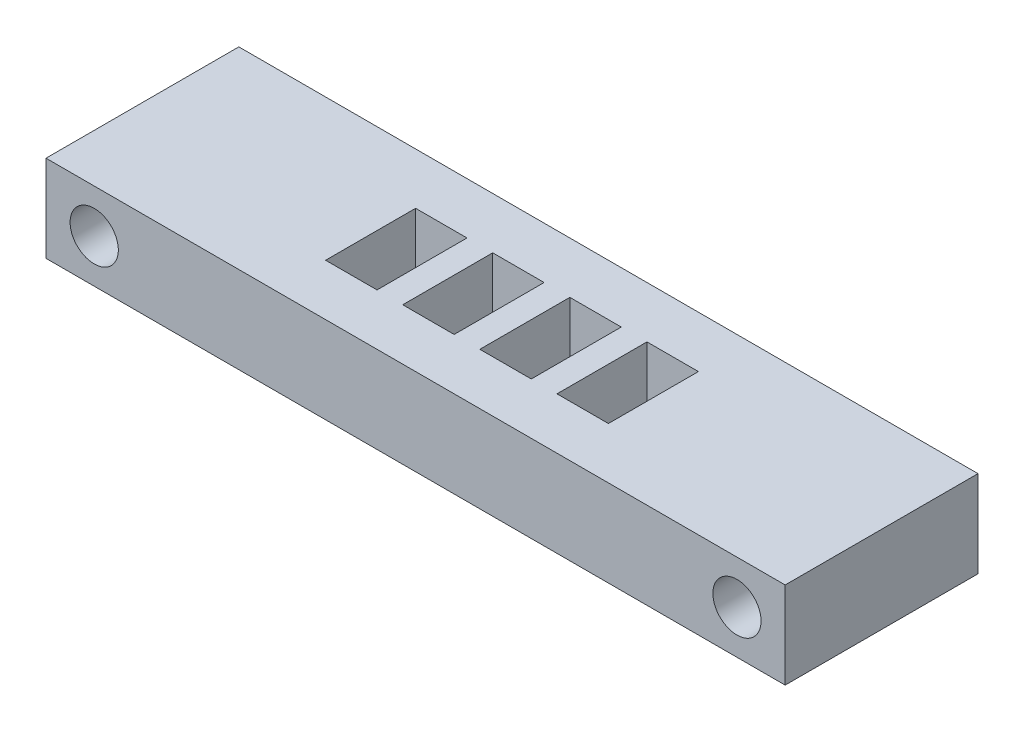
ISO-10303-21;
HEADER;
FILE_DESCRIPTION(('STEP AP214'),'2;1');
FILE_NAME('part.step','',(''),(''),'','','');
FILE_SCHEMA(('AUTOMOTIVE_DESIGN { 1 0 10303 214 1 1 1 1 }'));
ENDSEC;
DATA;
#1=APPLICATION_CONTEXT('core data for automotive mechanical design processes');
#2=APPLICATION_PROTOCOL_DEFINITION('international standard','automotive_design',2000,#1);
#3=PRODUCT_CONTEXT('',#1,'mechanical');
#4=PRODUCT('Part','Part','',(#3));
#5=PRODUCT_RELATED_PRODUCT_CATEGORY('part','',(#4));
#6=PRODUCT_DEFINITION_FORMATION('','',#4);
#7=PRODUCT_DEFINITION_CONTEXT('part definition',#1,'design');
#8=PRODUCT_DEFINITION('design','',#6,#7);
#9=PRODUCT_DEFINITION_SHAPE('','',#8);
#10=(LENGTH_UNIT() NAMED_UNIT(*) SI_UNIT(.MILLI.,.METRE.));
#11=(NAMED_UNIT(*) PLANE_ANGLE_UNIT() SI_UNIT($,.RADIAN.));
#12=(NAMED_UNIT(*) SI_UNIT($,.STERADIAN.) SOLID_ANGLE_UNIT());
#13=UNCERTAINTY_MEASURE_WITH_UNIT(LENGTH_MEASURE(1.E-05),#10,'distance_accuracy_value','');
#14=(GEOMETRIC_REPRESENTATION_CONTEXT(3) GLOBAL_UNCERTAINTY_ASSIGNED_CONTEXT((#13)) GLOBAL_UNIT_ASSIGNED_CONTEXT((#10,
#11,#12)) REPRESENTATION_CONTEXT('',''));
#15=CARTESIAN_POINT('',(0.,0.,0.));
#16=DIRECTION('',(0.,0.,1.));
#17=DIRECTION('',(1.,0.,0.));
#18=AXIS2_PLACEMENT_3D('',#15,#16,#17);
#19=CARTESIAN_POINT('',(0.,6.75,0.));
#20=DIRECTION('',(0.,-1.,0.));
#21=DIRECTION('',(0.,0.,-1.));
#22=AXIS2_PLACEMENT_3D('',#19,#20,#21);
#23=PLANE('',#22);
#24=DIRECTION('',(-1.,0.,0.));
#25=VECTOR('',#24,1.);
#26=CARTESIAN_POINT('',(17.75,6.75,-11.));
#27=LINE('',#26,#25);
#28=CARTESIAN_POINT('',(21.75,6.75,-11.));
#29=VERTEX_POINT('',#28);
#30=CARTESIAN_POINT('',(17.75,6.75,-11.));
#31=VERTEX_POINT('',#30);
#32=EDGE_CURVE('E219',#29,#31,#27,.T.);
#33=ORIENTED_EDGE('',*,*,#32,.F.);
#34=DIRECTION('',(0.,0.,-1.));
#35=VECTOR('',#34,1.);
#36=CARTESIAN_POINT('',(21.75,6.75,-11.));
#37=LINE('',#36,#35);
#38=CARTESIAN_POINT('',(21.75,6.75,-3.99999999999996));
#39=VERTEX_POINT('',#38);
#40=EDGE_CURVE('E227',#39,#29,#37,.T.);
#41=ORIENTED_EDGE('',*,*,#40,.F.);
#42=DIRECTION('',(1.,0.,0.));
#43=VECTOR('',#42,1.);
#44=CARTESIAN_POINT('',(17.75,6.75,-3.99999999999996));
#45=LINE('',#44,#43);
#46=CARTESIAN_POINT('',(17.75,6.75,-3.99999999999996));
#47=VERTEX_POINT('',#46);
#48=EDGE_CURVE('E224',#47,#39,#45,.T.);
#49=ORIENTED_EDGE('',*,*,#48,.F.);
#50=DIRECTION('',(0.,0.,1.));
#51=VECTOR('',#50,1.);
#52=CARTESIAN_POINT('',(17.75,6.75,-11.));
#53=LINE('',#52,#51);
#54=EDGE_CURVE('E221',#31,#47,#53,.T.);
#55=ORIENTED_EDGE('',*,*,#54,.F.);
#56=EDGE_LOOP('',(#33,#41,#49,#55));
#57=FACE_BOUND('',#56,.T.);
#58=DIRECTION('',(0.,0.,1.));
#59=VECTOR('',#58,1.);
#60=CARTESIAN_POINT('',(23.75,6.75,-11.));
#61=LINE('',#60,#59);
#62=CARTESIAN_POINT('',(23.75,6.75,-11.));
#63=VERTEX_POINT('',#62);
#64=CARTESIAN_POINT('',(23.75,6.75,-4.));
#65=VERTEX_POINT('',#64);
#66=EDGE_CURVE('E281',#63,#65,#61,.T.);
#67=ORIENTED_EDGE('',*,*,#66,.F.);
#68=DIRECTION('',(-1.,0.,0.));
#69=VECTOR('',#68,1.);
#70=CARTESIAN_POINT('',(23.75,6.75,-11.));
#71=LINE('',#70,#69);
#72=CARTESIAN_POINT('',(27.75,6.75,-11.));
#73=VERTEX_POINT('',#72);
#74=EDGE_CURVE('E289',#73,#63,#71,.T.);
#75=ORIENTED_EDGE('',*,*,#74,.F.);
#76=DIRECTION('',(0.,0.,-1.));
#77=VECTOR('',#76,1.);
#78=CARTESIAN_POINT('',(27.75,6.75,-11.));
#79=LINE('',#78,#77);
#80=CARTESIAN_POINT('',(27.75,6.75,-4.));
#81=VERTEX_POINT('',#80);
#82=EDGE_CURVE('E286',#81,#73,#79,.T.);
#83=ORIENTED_EDGE('',*,*,#82,.F.);
#84=DIRECTION('',(1.,0.,0.));
#85=VECTOR('',#84,1.);
#86=CARTESIAN_POINT('',(23.75,6.75,-4.));
#87=LINE('',#86,#85);
#88=EDGE_CURVE('E283',#65,#81,#87,.T.);
#89=ORIENTED_EDGE('',*,*,#88,.F.);
#90=EDGE_LOOP('',(#67,#75,#83,#89));
#91=FACE_BOUND('',#90,.T.);
#92=DIRECTION('',(0.,0.,1.));
#93=VECTOR('',#92,1.);
#94=CARTESIAN_POINT('',(0.,6.75,0.));
#95=LINE('',#94,#93);
#96=CARTESIAN_POINT('',(0.,6.75,-15.));
#97=VERTEX_POINT('',#96);
#98=CARTESIAN_POINT('',(0.,6.75,0.));
#99=VERTEX_POINT('',#98);
#100=EDGE_CURVE('E312',#97,#99,#95,.T.);
#101=ORIENTED_EDGE('',*,*,#100,.T.);
#102=DIRECTION('',(1.,0.,0.));
#103=VECTOR('',#102,1.);
#104=CARTESIAN_POINT('',(0.,6.75,0.));
#105=LINE('',#104,#103);
#106=CARTESIAN_POINT('',(57.5,6.75,0.));
#107=VERTEX_POINT('',#106);
#108=EDGE_CURVE('E315',#99,#107,#105,.T.);
#109=ORIENTED_EDGE('',*,*,#108,.T.);
#110=DIRECTION('',(0.,0.,-1.));
#111=VECTOR('',#110,1.);
#112=CARTESIAN_POINT('',(57.5,6.75,0.));
#113=LINE('',#112,#111);
#114=CARTESIAN_POINT('',(57.5,6.75,-15.));
#115=VERTEX_POINT('',#114);
#116=EDGE_CURVE('E318',#107,#115,#113,.T.);
#117=ORIENTED_EDGE('',*,*,#116,.T.);
#118=DIRECTION('',(-1.,0.,0.));
#119=VECTOR('',#118,1.);
#120=CARTESIAN_POINT('',(0.,6.75,-15.));
#121=LINE('',#120,#119);
#122=EDGE_CURVE('E320',#115,#97,#121,.T.);
#123=ORIENTED_EDGE('',*,*,#122,.T.);
#124=EDGE_LOOP('',(#101,#109,#117,#123));
#125=FACE_BOUND('',#124,.T.);
#126=DIRECTION('',(0.,0.,-1.));
#127=VECTOR('',#126,1.);
#128=CARTESIAN_POINT('',(33.75,6.75,-11.));
#129=LINE('',#128,#127);
#130=CARTESIAN_POINT('',(33.75,6.75,-4.));
#131=VERTEX_POINT('',#130);
#132=CARTESIAN_POINT('',(33.75,6.75,-11.));
#133=VERTEX_POINT('',#132);
#134=EDGE_CURVE('E250',#131,#133,#129,.T.);
#135=ORIENTED_EDGE('',*,*,#134,.F.);
#136=DIRECTION('',(1.,0.,0.));
#137=VECTOR('',#136,1.);
#138=CARTESIAN_POINT('',(33.75,6.75,-4.));
#139=LINE('',#138,#137);
#140=CARTESIAN_POINT('',(29.75,6.75,-4.));
#141=VERTEX_POINT('',#140);
#142=EDGE_CURVE('E258',#141,#131,#139,.T.);
#143=ORIENTED_EDGE('',*,*,#142,.F.);
#144=DIRECTION('',(0.,0.,1.));
#145=VECTOR('',#144,1.);
#146=CARTESIAN_POINT('',(29.75,6.75,-11.));
#147=LINE('',#146,#145);
#148=CARTESIAN_POINT('',(29.75,6.75,-11.));
#149=VERTEX_POINT('',#148);
#150=EDGE_CURVE('E255',#149,#141,#147,.T.);
#151=ORIENTED_EDGE('',*,*,#150,.F.);
#152=DIRECTION('',(-1.,0.,0.));
#153=VECTOR('',#152,1.);
#154=CARTESIAN_POINT('',(33.75,6.75,-11.));
#155=LINE('',#154,#153);
#156=EDGE_CURVE('E252',#133,#149,#155,.T.);
#157=ORIENTED_EDGE('',*,*,#156,.F.);
#158=EDGE_LOOP('',(#135,#143,#151,#157));
#159=FACE_BOUND('',#158,.T.);
#160=DIRECTION('',(0.,0.,-1.));
#161=VECTOR('',#160,1.);
#162=CARTESIAN_POINT('',(39.75,6.75,-11.));
#163=LINE('',#162,#161);
#164=CARTESIAN_POINT('',(39.75,6.75,-3.99999999999996));
#165=VERTEX_POINT('',#164);
#166=CARTESIAN_POINT('',(39.75,6.75,-11.));
#167=VERTEX_POINT('',#166);
#168=EDGE_CURVE('E181',#165,#167,#163,.T.);
#169=ORIENTED_EDGE('',*,*,#168,.F.);
#170=DIRECTION('',(1.,0.,0.));
#171=VECTOR('',#170,1.);
#172=CARTESIAN_POINT('',(39.75,6.75,-3.99999999999996));
#173=LINE('',#172,#171);
#174=CARTESIAN_POINT('',(35.75,6.75,-3.99999999999996));
#175=VERTEX_POINT('',#174);
#176=EDGE_CURVE('E203',#175,#165,#173,.T.);
#177=ORIENTED_EDGE('',*,*,#176,.F.);
#178=DIRECTION('',(0.,0.,1.));
#179=VECTOR('',#178,1.);
#180=CARTESIAN_POINT('',(35.75,6.75,-11.));
#181=LINE('',#180,#179);
#182=CARTESIAN_POINT('',(35.75,6.75,-11.));
#183=VERTEX_POINT('',#182);
#184=EDGE_CURVE('E201',#183,#175,#181,.T.);
#185=ORIENTED_EDGE('',*,*,#184,.F.);
#186=DIRECTION('',(-1.,0.,0.));
#187=VECTOR('',#186,1.);
#188=CARTESIAN_POINT('',(39.75,6.75,-11.));
#189=LINE('',#188,#187);
#190=EDGE_CURVE('E189',#167,#183,#189,.T.);
#191=ORIENTED_EDGE('',*,*,#190,.F.);
#192=EDGE_LOOP('',(#169,#177,#185,#191));
#193=FACE_BOUND('',#192,.T.);
#194=ADVANCED_FACE('F44',(#57,#91,#125,#159,#193),#23,.F.);
#195=CARTESIAN_POINT('',(0.,0.,0.));
#196=DIRECTION('',(0.,-1.,0.));
#197=DIRECTION('',(0.,0.,-1.));
#198=AXIS2_PLACEMENT_3D('',#195,#196,#197);
#199=PLANE('',#198);
#200=DIRECTION('',(0.,0.,1.));
#201=VECTOR('',#200,1.);
#202=CARTESIAN_POINT('',(0.,0.,0.));
#203=LINE('',#202,#201);
#204=CARTESIAN_POINT('',(0.,0.,-15.));
#205=VERTEX_POINT('',#204);
#206=CARTESIAN_POINT('',(0.,0.,0.));
#207=VERTEX_POINT('',#206);
#208=EDGE_CURVE('E311',#205,#207,#203,.T.);
#209=ORIENTED_EDGE('',*,*,#208,.F.);
#210=DIRECTION('',(-1.,0.,0.));
#211=VECTOR('',#210,1.);
#212=CARTESIAN_POINT('',(0.,0.,-15.));
#213=LINE('',#212,#211);
#214=CARTESIAN_POINT('',(57.5,0.,-15.));
#215=VERTEX_POINT('',#214);
#216=EDGE_CURVE('E316',#215,#205,#213,.T.);
#217=ORIENTED_EDGE('',*,*,#216,.F.);
#218=DIRECTION('',(0.,0.,-1.));
#219=VECTOR('',#218,1.);
#220=CARTESIAN_POINT('',(57.5,0.,0.));
#221=LINE('',#220,#219);
#222=CARTESIAN_POINT('',(57.5,0.,0.));
#223=VERTEX_POINT('',#222);
#224=EDGE_CURVE('E327',#223,#215,#221,.T.);
#225=ORIENTED_EDGE('',*,*,#224,.F.);
#226=DIRECTION('',(1.,0.,0.));
#227=VECTOR('',#226,1.);
#228=CARTESIAN_POINT('',(0.,0.,0.));
#229=LINE('',#228,#227);
#230=EDGE_CURVE('E325',#207,#223,#229,.T.);
#231=ORIENTED_EDGE('',*,*,#230,.F.);
#232=EDGE_LOOP('',(#209,#217,#225,#231));
#233=FACE_BOUND('',#232,.T.);
#234=DIRECTION('',(-1.,0.,0.));
#235=VECTOR('',#234,1.);
#236=CARTESIAN_POINT('',(23.75,0.,-11.));
#237=LINE('',#236,#235);
#238=CARTESIAN_POINT('',(27.75,0.,-11.));
#239=VERTEX_POINT('',#238);
#240=CARTESIAN_POINT('',(23.75,0.,-11.));
#241=VERTEX_POINT('',#240);
#242=EDGE_CURVE('E284',#239,#241,#237,.T.);
#243=ORIENTED_EDGE('',*,*,#242,.T.);
#244=DIRECTION('',(0.,0.,1.));
#245=VECTOR('',#244,1.);
#246=CARTESIAN_POINT('',(23.75,0.,-11.));
#247=LINE('',#246,#245);
#248=CARTESIAN_POINT('',(23.75,0.,-4.));
#249=VERTEX_POINT('',#248);
#250=EDGE_CURVE('E280',#241,#249,#247,.T.);
#251=ORIENTED_EDGE('',*,*,#250,.T.);
#252=DIRECTION('',(1.,0.,0.));
#253=VECTOR('',#252,1.);
#254=CARTESIAN_POINT('',(23.75,0.,-4.));
#255=LINE('',#254,#253);
#256=CARTESIAN_POINT('',(27.75,0.,-4.));
#257=VERTEX_POINT('',#256);
#258=EDGE_CURVE('E294',#249,#257,#255,.T.);
#259=ORIENTED_EDGE('',*,*,#258,.T.);
#260=DIRECTION('',(0.,0.,-1.));
#261=VECTOR('',#260,1.);
#262=CARTESIAN_POINT('',(27.75,0.,-11.));
#263=LINE('',#262,#261);
#264=EDGE_CURVE('E297',#257,#239,#263,.T.);
#265=ORIENTED_EDGE('',*,*,#264,.T.);
#266=EDGE_LOOP('',(#243,#251,#259,#265));
#267=FACE_BOUND('',#266,.T.);
#268=DIRECTION('',(1.,0.,0.));
#269=VECTOR('',#268,1.);
#270=CARTESIAN_POINT('',(33.75,0.,-4.));
#271=LINE('',#270,#269);
#272=CARTESIAN_POINT('',(29.75,0.,-4.));
#273=VERTEX_POINT('',#272);
#274=CARTESIAN_POINT('',(33.75,0.,-4.));
#275=VERTEX_POINT('',#274);
#276=EDGE_CURVE('E253',#273,#275,#271,.T.);
#277=ORIENTED_EDGE('',*,*,#276,.T.);
#278=DIRECTION('',(0.,0.,-1.));
#279=VECTOR('',#278,1.);
#280=CARTESIAN_POINT('',(33.75,0.,-11.));
#281=LINE('',#280,#279);
#282=CARTESIAN_POINT('',(33.75,0.,-11.));
#283=VERTEX_POINT('',#282);
#284=EDGE_CURVE('E249',#275,#283,#281,.T.);
#285=ORIENTED_EDGE('',*,*,#284,.T.);
#286=DIRECTION('',(-1.,0.,0.));
#287=VECTOR('',#286,1.);
#288=CARTESIAN_POINT('',(33.75,0.,-11.));
#289=LINE('',#288,#287);
#290=CARTESIAN_POINT('',(29.75,0.,-11.));
#291=VERTEX_POINT('',#290);
#292=EDGE_CURVE('E263',#283,#291,#289,.T.);
#293=ORIENTED_EDGE('',*,*,#292,.T.);
#294=DIRECTION('',(0.,0.,1.));
#295=VECTOR('',#294,1.);
#296=CARTESIAN_POINT('',(29.75,0.,-11.));
#297=LINE('',#296,#295);
#298=EDGE_CURVE('E266',#291,#273,#297,.T.);
#299=ORIENTED_EDGE('',*,*,#298,.T.);
#300=EDGE_LOOP('',(#277,#285,#293,#299));
#301=FACE_BOUND('',#300,.T.);
#302=DIRECTION('',(0.,0.,-1.));
#303=VECTOR('',#302,1.);
#304=CARTESIAN_POINT('',(21.75,0.,-11.));
#305=LINE('',#304,#303);
#306=CARTESIAN_POINT('',(21.75,0.,-3.99999999999996));
#307=VERTEX_POINT('',#306);
#308=CARTESIAN_POINT('',(21.75,0.,-11.));
#309=VERTEX_POINT('',#308);
#310=EDGE_CURVE('E222',#307,#309,#305,.T.);
#311=ORIENTED_EDGE('',*,*,#310,.T.);
#312=DIRECTION('',(-1.,0.,0.));
#313=VECTOR('',#312,1.);
#314=CARTESIAN_POINT('',(17.75,0.,-11.));
#315=LINE('',#314,#313);
#316=CARTESIAN_POINT('',(17.75,0.,-11.));
#317=VERTEX_POINT('',#316);
#318=EDGE_CURVE('E197',#309,#317,#315,.T.);
#319=ORIENTED_EDGE('',*,*,#318,.T.);
#320=DIRECTION('',(0.,0.,1.));
#321=VECTOR('',#320,1.);
#322=CARTESIAN_POINT('',(17.75,0.,-11.));
#323=LINE('',#322,#321);
#324=CARTESIAN_POINT('',(17.75,0.,-3.99999999999996));
#325=VERTEX_POINT('',#324);
#326=EDGE_CURVE('E232',#317,#325,#323,.T.);
#327=ORIENTED_EDGE('',*,*,#326,.T.);
#328=DIRECTION('',(1.,0.,0.));
#329=VECTOR('',#328,1.);
#330=CARTESIAN_POINT('',(17.75,0.,-3.99999999999996));
#331=LINE('',#330,#329);
#332=EDGE_CURVE('E235',#325,#307,#331,.T.);
#333=ORIENTED_EDGE('',*,*,#332,.T.);
#334=EDGE_LOOP('',(#311,#319,#327,#333));
#335=FACE_BOUND('',#334,.T.);
#336=DIRECTION('',(1.,0.,0.));
#337=VECTOR('',#336,1.);
#338=CARTESIAN_POINT('',(39.75,0.,-3.99999999999996));
#339=LINE('',#338,#337);
#340=CARTESIAN_POINT('',(35.75,0.,-3.99999999999996));
#341=VERTEX_POINT('',#340);
#342=CARTESIAN_POINT('',(39.75,0.,-3.99999999999996));
#343=VERTEX_POINT('',#342);
#344=EDGE_CURVE('E190',#341,#343,#339,.T.);
#345=ORIENTED_EDGE('',*,*,#344,.T.);
#346=DIRECTION('',(0.,0.,-1.));
#347=VECTOR('',#346,1.);
#348=CARTESIAN_POINT('',(39.75,0.,-11.));
#349=LINE('',#348,#347);
#350=CARTESIAN_POINT('',(39.75,0.,-11.));
#351=VERTEX_POINT('',#350);
#352=EDGE_CURVE('E67',#343,#351,#349,.T.);
#353=ORIENTED_EDGE('',*,*,#352,.T.);
#354=DIRECTION('',(-1.,0.,0.));
#355=VECTOR('',#354,1.);
#356=CARTESIAN_POINT('',(39.75,0.,-11.));
#357=LINE('',#356,#355);
#358=CARTESIAN_POINT('',(35.75,0.,-11.));
#359=VERTEX_POINT('',#358);
#360=EDGE_CURVE('E196',#351,#359,#357,.T.);
#361=ORIENTED_EDGE('',*,*,#360,.T.);
#362=DIRECTION('',(0.,0.,1.));
#363=VECTOR('',#362,1.);
#364=CARTESIAN_POINT('',(35.75,0.,-11.));
#365=LINE('',#364,#363);
#366=EDGE_CURVE('E211',#359,#341,#365,.T.);
#367=ORIENTED_EDGE('',*,*,#366,.T.);
#368=EDGE_LOOP('',(#345,#353,#361,#367));
#369=FACE_BOUND('',#368,.T.);
#370=ADVANCED_FACE('F345',(#233,#267,#301,#335,#369),#199,.T.);
#371=CARTESIAN_POINT('',(0.,6.75,0.));
#372=DIRECTION('',(1.,0.,0.));
#373=DIRECTION('',(0.,0.,-1.));
#374=AXIS2_PLACEMENT_3D('',#371,#372,#373);
#375=PLANE('',#374);
#376=ORIENTED_EDGE('',*,*,#208,.T.);
#377=DIRECTION('',(0.,-1.,0.));
#378=VECTOR('',#377,1.);
#379=CARTESIAN_POINT('',(0.,6.75,0.));
#380=LINE('',#379,#378);
#381=EDGE_CURVE('E13',#99,#207,#380,.T.);
#382=ORIENTED_EDGE('',*,*,#381,.F.);
#383=ORIENTED_EDGE('',*,*,#100,.F.);
#384=DIRECTION('',(0.,-1.,0.));
#385=VECTOR('',#384,1.);
#386=CARTESIAN_POINT('',(0.,6.75,-15.));
#387=LINE('',#386,#385);
#388=EDGE_CURVE('E322',#97,#205,#387,.T.);
#389=ORIENTED_EDGE('',*,*,#388,.T.);
#390=EDGE_LOOP('',(#376,#382,#383,#389));
#391=FACE_BOUND('',#390,.T.);
#392=ADVANCED_FACE('F46',(#391),#375,.F.);
#393=CARTESIAN_POINT('',(0.,6.75,0.));
#394=DIRECTION('',(0.,0.,-1.));
#395=DIRECTION('',(-1.,0.,0.));
#396=AXIS2_PLACEMENT_3D('',#393,#394,#395);
#397=PLANE('',#396);
#398=CARTESIAN_POINT('',(53.75,3.375,0.));
#399=DIRECTION('',(0.,0.,-1.));
#400=DIRECTION('',(-1.,0.,0.));
#401=AXIS2_PLACEMENT_3D('',#398,#399,#400);
#402=CIRCLE('',#401,1.875);
#403=CARTESIAN_POINT('',(51.875,3.375,0.));
#404=VERTEX_POINT('',#403);
#405=EDGE_CURVE('E209',#404,#404,#402,.T.);
#406=ORIENTED_EDGE('',*,*,#405,.T.);
#407=EDGE_LOOP('',(#406));
#408=FACE_BOUND('',#407,.T.);
#409=CARTESIAN_POINT('',(3.75,3.375,0.));
#410=DIRECTION('',(0.,0.,-1.));
#411=DIRECTION('',(-1.,0.,0.));
#412=AXIS2_PLACEMENT_3D('',#409,#410,#411);
#413=CIRCLE('',#412,1.875);
#414=CARTESIAN_POINT('',(1.875,3.375,0.));
#415=VERTEX_POINT('',#414);
#416=EDGE_CURVE('E394',#415,#415,#413,.T.);
#417=ORIENTED_EDGE('',*,*,#416,.T.);
#418=EDGE_LOOP('',(#417));
#419=FACE_BOUND('',#418,.T.);
#420=ORIENTED_EDGE('',*,*,#230,.T.);
#421=DIRECTION('',(0.,-1.,0.));
#422=VECTOR('',#421,1.);
#423=CARTESIAN_POINT('',(57.5,6.75,0.));
#424=LINE('',#423,#422);
#425=EDGE_CURVE('E52',#107,#223,#424,.T.);
#426=ORIENTED_EDGE('',*,*,#425,.F.);
#427=ORIENTED_EDGE('',*,*,#108,.F.);
#428=ORIENTED_EDGE('',*,*,#381,.T.);
#429=EDGE_LOOP('',(#420,#426,#427,#428));
#430=FACE_BOUND('',#429,.T.);
#431=ADVANCED_FACE('F356',(#408,#419,#430),#397,.F.);
#432=CARTESIAN_POINT('',(57.5,6.75,0.));
#433=DIRECTION('',(-1.,0.,0.));
#434=DIRECTION('',(0.,0.,1.));
#435=AXIS2_PLACEMENT_3D('',#432,#433,#434);
#436=PLANE('',#435);
#437=ORIENTED_EDGE('',*,*,#224,.T.);
#438=DIRECTION('',(0.,-1.,0.));
#439=VECTOR('',#438,1.);
#440=CARTESIAN_POINT('',(57.5,6.75,-15.));
#441=LINE('',#440,#439);
#442=EDGE_CURVE('E332',#115,#215,#441,.T.);
#443=ORIENTED_EDGE('',*,*,#442,.F.);
#444=ORIENTED_EDGE('',*,*,#116,.F.);
#445=ORIENTED_EDGE('',*,*,#425,.T.);
#446=EDGE_LOOP('',(#437,#443,#444,#445));
#447=FACE_BOUND('',#446,.T.);
#448=ADVANCED_FACE('F339',(#447),#436,.F.);
#449=CARTESIAN_POINT('',(0.,6.75,-15.));
#450=DIRECTION('',(0.,0.,1.));
#451=DIRECTION('',(1.,0.,0.));
#452=AXIS2_PLACEMENT_3D('',#449,#450,#451);
#453=PLANE('',#452);
#454=CARTESIAN_POINT('',(53.75,3.375,-15.));
#455=DIRECTION('',(0.,0.,-1.));
#456=DIRECTION('',(-1.,0.,0.));
#457=AXIS2_PLACEMENT_3D('',#454,#455,#456);
#458=CIRCLE('',#457,1.875);
#459=CARTESIAN_POINT('',(51.875,3.375,-15.));
#460=VERTEX_POINT('',#459);
#461=EDGE_CURVE('E389',#460,#460,#458,.T.);
#462=ORIENTED_EDGE('',*,*,#461,.F.);
#463=EDGE_LOOP('',(#462));
#464=FACE_BOUND('',#463,.T.);
#465=CARTESIAN_POINT('',(3.75,3.375,-15.));
#466=DIRECTION('',(0.,0.,-1.));
#467=DIRECTION('',(-1.,0.,0.));
#468=AXIS2_PLACEMENT_3D('',#465,#466,#467);
#469=CIRCLE('',#468,1.875);
#470=CARTESIAN_POINT('',(1.875,3.375,-15.));
#471=VERTEX_POINT('',#470);
#472=EDGE_CURVE('E392',#471,#471,#469,.T.);
#473=ORIENTED_EDGE('',*,*,#472,.F.);
#474=EDGE_LOOP('',(#473));
#475=FACE_BOUND('',#474,.T.);
#476=ORIENTED_EDGE('',*,*,#216,.T.);
#477=ORIENTED_EDGE('',*,*,#388,.F.);
#478=ORIENTED_EDGE('',*,*,#122,.F.);
#479=ORIENTED_EDGE('',*,*,#442,.T.);
#480=EDGE_LOOP('',(#476,#477,#478,#479));
#481=FACE_BOUND('',#480,.T.);
#482=ADVANCED_FACE('F349',(#464,#475,#481),#453,.F.);
#483=CARTESIAN_POINT('',(23.75,6.75,-11.));
#484=DIRECTION('',(1.,0.,0.));
#485=DIRECTION('',(0.,0.,-1.));
#486=AXIS2_PLACEMENT_3D('',#483,#484,#485);
#487=PLANE('',#486);
#488=ORIENTED_EDGE('',*,*,#250,.F.);
#489=DIRECTION('',(0.,-1.,0.));
#490=VECTOR('',#489,1.);
#491=CARTESIAN_POINT('',(23.75,6.75,-11.));
#492=LINE('',#491,#490);
#493=EDGE_CURVE('E291',#63,#241,#492,.T.);
#494=ORIENTED_EDGE('',*,*,#493,.F.);
#495=ORIENTED_EDGE('',*,*,#66,.T.);
#496=DIRECTION('',(0.,-1.,0.));
#497=VECTOR('',#496,1.);
#498=CARTESIAN_POINT('',(23.75,6.75,-4.));
#499=LINE('',#498,#497);
#500=EDGE_CURVE('E308',#65,#249,#499,.T.);
#501=ORIENTED_EDGE('',*,*,#500,.T.);
#502=EDGE_LOOP('',(#488,#494,#495,#501));
#503=FACE_BOUND('',#502,.T.);
#504=ADVANCED_FACE('F376',(#503),#487,.T.);
#505=CARTESIAN_POINT('',(23.75,6.75,-4.));
#506=DIRECTION('',(0.,0.,-1.));
#507=DIRECTION('',(-1.,0.,0.));
#508=AXIS2_PLACEMENT_3D('',#505,#506,#507);
#509=PLANE('',#508);
#510=ORIENTED_EDGE('',*,*,#258,.F.);
#511=ORIENTED_EDGE('',*,*,#500,.F.);
#512=ORIENTED_EDGE('',*,*,#88,.T.);
#513=DIRECTION('',(0.,-1.,0.));
#514=VECTOR('',#513,1.);
#515=CARTESIAN_POINT('',(27.75,6.75,-4.));
#516=LINE('',#515,#514);
#517=EDGE_CURVE('E306',#81,#257,#516,.T.);
#518=ORIENTED_EDGE('',*,*,#517,.T.);
#519=EDGE_LOOP('',(#510,#511,#512,#518));
#520=FACE_BOUND('',#519,.T.);
#521=ADVANCED_FACE('F384',(#520),#509,.T.);
#522=CARTESIAN_POINT('',(27.75,6.75,-11.));
#523=DIRECTION('',(-1.,0.,0.));
#524=DIRECTION('',(0.,0.,1.));
#525=AXIS2_PLACEMENT_3D('',#522,#523,#524);
#526=PLANE('',#525);
#527=ORIENTED_EDGE('',*,*,#264,.F.);
#528=ORIENTED_EDGE('',*,*,#517,.F.);
#529=ORIENTED_EDGE('',*,*,#82,.T.);
#530=DIRECTION('',(0.,-1.,0.));
#531=VECTOR('',#530,1.);
#532=CARTESIAN_POINT('',(27.75,6.75,-11.));
#533=LINE('',#532,#531);
#534=EDGE_CURVE('E304',#73,#239,#533,.T.);
#535=ORIENTED_EDGE('',*,*,#534,.T.);
#536=EDGE_LOOP('',(#527,#528,#529,#535));
#537=FACE_BOUND('',#536,.T.);
#538=ADVANCED_FACE('F458',(#537),#526,.T.);
#539=CARTESIAN_POINT('',(23.75,6.75,-11.));
#540=DIRECTION('',(0.,0.,1.));
#541=DIRECTION('',(1.,0.,0.));
#542=AXIS2_PLACEMENT_3D('',#539,#540,#541);
#543=PLANE('',#542);
#544=ORIENTED_EDGE('',*,*,#242,.F.);
#545=ORIENTED_EDGE('',*,*,#534,.F.);
#546=ORIENTED_EDGE('',*,*,#74,.T.);
#547=ORIENTED_EDGE('',*,*,#493,.T.);
#548=EDGE_LOOP('',(#544,#545,#546,#547));
#549=FACE_BOUND('',#548,.T.);
#550=ADVANCED_FACE('F454',(#549),#543,.T.);
#551=CARTESIAN_POINT('',(33.75,6.75,-11.));
#552=DIRECTION('',(-1.,0.,0.));
#553=DIRECTION('',(0.,0.,1.));
#554=AXIS2_PLACEMENT_3D('',#551,#552,#553);
#555=PLANE('',#554);
#556=ORIENTED_EDGE('',*,*,#284,.F.);
#557=DIRECTION('',(0.,-1.,0.));
#558=VECTOR('',#557,1.);
#559=CARTESIAN_POINT('',(33.75,6.75,-4.));
#560=LINE('',#559,#558);
#561=EDGE_CURVE('E260',#131,#275,#560,.T.);
#562=ORIENTED_EDGE('',*,*,#561,.F.);
#563=ORIENTED_EDGE('',*,*,#134,.T.);
#564=DIRECTION('',(0.,-1.,0.));
#565=VECTOR('',#564,1.);
#566=CARTESIAN_POINT('',(33.75,6.75,-11.));
#567=LINE('',#566,#565);
#568=EDGE_CURVE('E277',#133,#283,#567,.T.);
#569=ORIENTED_EDGE('',*,*,#568,.T.);
#570=EDGE_LOOP('',(#556,#562,#563,#569));
#571=FACE_BOUND('',#570,.T.);
#572=ADVANCED_FACE('F450',(#571),#555,.T.);
#573=CARTESIAN_POINT('',(33.75,6.75,-11.));
#574=DIRECTION('',(0.,0.,1.));
#575=DIRECTION('',(1.,0.,0.));
#576=AXIS2_PLACEMENT_3D('',#573,#574,#575);
#577=PLANE('',#576);
#578=ORIENTED_EDGE('',*,*,#292,.F.);
#579=ORIENTED_EDGE('',*,*,#568,.F.);
#580=ORIENTED_EDGE('',*,*,#156,.T.);
#581=DIRECTION('',(0.,-1.,0.));
#582=VECTOR('',#581,1.);
#583=CARTESIAN_POINT('',(29.75,6.75,-11.));
#584=LINE('',#583,#582);
#585=EDGE_CURVE('E275',#149,#291,#584,.T.);
#586=ORIENTED_EDGE('',*,*,#585,.T.);
#587=EDGE_LOOP('',(#578,#579,#580,#586));
#588=FACE_BOUND('',#587,.T.);
#589=ADVANCED_FACE('F446',(#588),#577,.T.);
#590=CARTESIAN_POINT('',(29.75,6.75,-11.));
#591=DIRECTION('',(1.,0.,0.));
#592=DIRECTION('',(0.,0.,-1.));
#593=AXIS2_PLACEMENT_3D('',#590,#591,#592);
#594=PLANE('',#593);
#595=ORIENTED_EDGE('',*,*,#298,.F.);
#596=ORIENTED_EDGE('',*,*,#585,.F.);
#597=ORIENTED_EDGE('',*,*,#150,.T.);
#598=DIRECTION('',(0.,-1.,0.));
#599=VECTOR('',#598,1.);
#600=CARTESIAN_POINT('',(29.75,6.75,-4.));
#601=LINE('',#600,#599);
#602=EDGE_CURVE('E273',#141,#273,#601,.T.);
#603=ORIENTED_EDGE('',*,*,#602,.T.);
#604=EDGE_LOOP('',(#595,#596,#597,#603));
#605=FACE_BOUND('',#604,.T.);
#606=ADVANCED_FACE('F442',(#605),#594,.T.);
#607=CARTESIAN_POINT('',(33.75,6.75,-4.));
#608=DIRECTION('',(0.,0.,-1.));
#609=DIRECTION('',(-1.,0.,0.));
#610=AXIS2_PLACEMENT_3D('',#607,#608,#609);
#611=PLANE('',#610);
#612=ORIENTED_EDGE('',*,*,#276,.F.);
#613=ORIENTED_EDGE('',*,*,#602,.F.);
#614=ORIENTED_EDGE('',*,*,#142,.T.);
#615=ORIENTED_EDGE('',*,*,#561,.T.);
#616=EDGE_LOOP('',(#612,#613,#614,#615));
#617=FACE_BOUND('',#616,.T.);
#618=ADVANCED_FACE('F438',(#617),#611,.T.);
#619=CARTESIAN_POINT('',(17.75,6.75,-11.));
#620=DIRECTION('',(0.,0.,1.));
#621=DIRECTION('',(1.,0.,0.));
#622=AXIS2_PLACEMENT_3D('',#619,#620,#621);
#623=PLANE('',#622);
#624=ORIENTED_EDGE('',*,*,#318,.F.);
#625=DIRECTION('',(0.,-1.,0.));
#626=VECTOR('',#625,1.);
#627=CARTESIAN_POINT('',(21.75,6.75,-11.));
#628=LINE('',#627,#626);
#629=EDGE_CURVE('E229',#29,#309,#628,.T.);
#630=ORIENTED_EDGE('',*,*,#629,.F.);
#631=ORIENTED_EDGE('',*,*,#32,.T.);
#632=DIRECTION('',(0.,-1.,0.));
#633=VECTOR('',#632,1.);
#634=CARTESIAN_POINT('',(17.75,6.75,-11.));
#635=LINE('',#634,#633);
#636=EDGE_CURVE('E246',#31,#317,#635,.T.);
#637=ORIENTED_EDGE('',*,*,#636,.T.);
#638=EDGE_LOOP('',(#624,#630,#631,#637));
#639=FACE_BOUND('',#638,.T.);
#640=ADVANCED_FACE('F434',(#639),#623,.T.);
#641=CARTESIAN_POINT('',(17.75,6.75,-11.));
#642=DIRECTION('',(1.,0.,0.));
#643=DIRECTION('',(0.,0.,-1.));
#644=AXIS2_PLACEMENT_3D('',#641,#642,#643);
#645=PLANE('',#644);
#646=ORIENTED_EDGE('',*,*,#326,.F.);
#647=ORIENTED_EDGE('',*,*,#636,.F.);
#648=ORIENTED_EDGE('',*,*,#54,.T.);
#649=DIRECTION('',(0.,-1.,0.));
#650=VECTOR('',#649,1.);
#651=CARTESIAN_POINT('',(17.75,6.75,-3.99999999999996));
#652=LINE('',#651,#650);
#653=EDGE_CURVE('E244',#47,#325,#652,.T.);
#654=ORIENTED_EDGE('',*,*,#653,.T.);
#655=EDGE_LOOP('',(#646,#647,#648,#654));
#656=FACE_BOUND('',#655,.T.);
#657=ADVANCED_FACE('F430',(#656),#645,.T.);
#658=CARTESIAN_POINT('',(17.75,6.75,-3.99999999999996));
#659=DIRECTION('',(0.,0.,-1.));
#660=DIRECTION('',(-1.,0.,0.));
#661=AXIS2_PLACEMENT_3D('',#658,#659,#660);
#662=PLANE('',#661);
#663=ORIENTED_EDGE('',*,*,#332,.F.);
#664=ORIENTED_EDGE('',*,*,#653,.F.);
#665=ORIENTED_EDGE('',*,*,#48,.T.);
#666=DIRECTION('',(0.,-1.,0.));
#667=VECTOR('',#666,1.);
#668=CARTESIAN_POINT('',(21.75,6.75,-3.99999999999996));
#669=LINE('',#668,#667);
#670=EDGE_CURVE('E242',#39,#307,#669,.T.);
#671=ORIENTED_EDGE('',*,*,#670,.T.);
#672=EDGE_LOOP('',(#663,#664,#665,#671));
#673=FACE_BOUND('',#672,.T.);
#674=ADVANCED_FACE('F426',(#673),#662,.T.);
#675=CARTESIAN_POINT('',(21.75,6.75,-11.));
#676=DIRECTION('',(-1.,0.,0.));
#677=DIRECTION('',(0.,0.,1.));
#678=AXIS2_PLACEMENT_3D('',#675,#676,#677);
#679=PLANE('',#678);
#680=ORIENTED_EDGE('',*,*,#310,.F.);
#681=ORIENTED_EDGE('',*,*,#670,.F.);
#682=ORIENTED_EDGE('',*,*,#40,.T.);
#683=ORIENTED_EDGE('',*,*,#629,.T.);
#684=EDGE_LOOP('',(#680,#681,#682,#683));
#685=FACE_BOUND('',#684,.T.);
#686=ADVANCED_FACE('F423',(#685),#679,.T.);
#687=CARTESIAN_POINT('',(39.75,6.75,-11.));
#688=DIRECTION('',(-1.,0.,0.));
#689=DIRECTION('',(0.,0.,1.));
#690=AXIS2_PLACEMENT_3D('',#687,#688,#689);
#691=PLANE('',#690);
#692=ORIENTED_EDGE('',*,*,#352,.F.);
#693=DIRECTION('',(0.,-1.,0.));
#694=VECTOR('',#693,1.);
#695=CARTESIAN_POINT('',(39.75,6.75,-3.99999999999996));
#696=LINE('',#695,#694);
#697=EDGE_CURVE('E185',#165,#343,#696,.T.);
#698=ORIENTED_EDGE('',*,*,#697,.F.);
#699=ORIENTED_EDGE('',*,*,#168,.T.);
#700=DIRECTION('',(0.,-1.,0.));
#701=VECTOR('',#700,1.);
#702=CARTESIAN_POINT('',(39.75,6.75,-11.));
#703=LINE('',#702,#701);
#704=EDGE_CURVE('E184',#167,#351,#703,.T.);
#705=ORIENTED_EDGE('',*,*,#704,.T.);
#706=EDGE_LOOP('',(#692,#698,#699,#705));
#707=FACE_BOUND('',#706,.T.);
#708=ADVANCED_FACE('F183',(#707),#691,.T.);
#709=CARTESIAN_POINT('',(39.75,6.75,-11.));
#710=DIRECTION('',(0.,0.,1.));
#711=DIRECTION('',(1.,0.,0.));
#712=AXIS2_PLACEMENT_3D('',#709,#710,#711);
#713=PLANE('',#712);
#714=ORIENTED_EDGE('',*,*,#360,.F.);
#715=ORIENTED_EDGE('',*,*,#704,.F.);
#716=ORIENTED_EDGE('',*,*,#190,.T.);
#717=DIRECTION('',(0.,-1.,0.));
#718=VECTOR('',#717,1.);
#719=CARTESIAN_POINT('',(35.75,6.75,-11.));
#720=LINE('',#719,#718);
#721=EDGE_CURVE('E198',#183,#359,#720,.T.);
#722=ORIENTED_EDGE('',*,*,#721,.T.);
#723=EDGE_LOOP('',(#714,#715,#716,#722));
#724=FACE_BOUND('',#723,.T.);
#725=ADVANCED_FACE('F193',(#724),#713,.T.);
#726=CARTESIAN_POINT('',(35.75,6.75,-11.));
#727=DIRECTION('',(1.,0.,0.));
#728=DIRECTION('',(0.,0.,-1.));
#729=AXIS2_PLACEMENT_3D('',#726,#727,#728);
#730=PLANE('',#729);
#731=ORIENTED_EDGE('',*,*,#366,.F.);
#732=ORIENTED_EDGE('',*,*,#721,.F.);
#733=ORIENTED_EDGE('',*,*,#184,.T.);
#734=DIRECTION('',(0.,-1.,0.));
#735=VECTOR('',#734,1.);
#736=CARTESIAN_POINT('',(35.75,6.75,-3.99999999999996));
#737=LINE('',#736,#735);
#738=EDGE_CURVE('E59',#175,#341,#737,.T.);
#739=ORIENTED_EDGE('',*,*,#738,.T.);
#740=EDGE_LOOP('',(#731,#732,#733,#739));
#741=FACE_BOUND('',#740,.T.);
#742=ADVANCED_FACE('F415',(#741),#730,.T.);
#743=CARTESIAN_POINT('',(39.75,6.75,-3.99999999999996));
#744=DIRECTION('',(0.,0.,-1.));
#745=DIRECTION('',(-1.,0.,0.));
#746=AXIS2_PLACEMENT_3D('',#743,#744,#745);
#747=PLANE('',#746);
#748=ORIENTED_EDGE('',*,*,#344,.F.);
#749=ORIENTED_EDGE('',*,*,#738,.F.);
#750=ORIENTED_EDGE('',*,*,#176,.T.);
#751=ORIENTED_EDGE('',*,*,#697,.T.);
#752=EDGE_LOOP('',(#748,#749,#750,#751));
#753=FACE_BOUND('',#752,.T.);
#754=ADVANCED_FACE('F409',(#753),#747,.T.);
#755=CARTESIAN_POINT('',(3.75,3.375,0.));
#756=DIRECTION('',(0.,0.,-1.));
#757=DIRECTION('',(-1.,0.,0.));
#758=AXIS2_PLACEMENT_3D('',#755,#756,#757);
#759=CYLINDRICAL_SURFACE('',#758,1.875);
#760=ORIENTED_EDGE('',*,*,#416,.F.);
#761=EDGE_LOOP('',(#760));
#762=FACE_BOUND('',#761,.T.);
#763=ORIENTED_EDGE('',*,*,#472,.T.);
#764=EDGE_LOOP('',(#763));
#765=FACE_BOUND('',#764,.T.);
#766=ADVANCED_FACE('F404',(#762,#765),#759,.F.);
#767=CARTESIAN_POINT('',(53.75,3.375,0.));
#768=DIRECTION('',(0.,0.,-1.));
#769=DIRECTION('',(-1.,0.,0.));
#770=AXIS2_PLACEMENT_3D('',#767,#768,#769);
#771=CYLINDRICAL_SURFACE('',#770,1.875);
#772=ORIENTED_EDGE('',*,*,#405,.F.);
#773=EDGE_LOOP('',(#772));
#774=FACE_BOUND('',#773,.T.);
#775=ORIENTED_EDGE('',*,*,#461,.T.);
#776=EDGE_LOOP('',(#775));
#777=FACE_BOUND('',#776,.T.);
#778=ADVANCED_FACE('F401',(#774,#777),#771,.F.);
#779=CLOSED_SHELL('',(#194,#370,#392,#431,#448,#482,#504,#521,#538,#550,#572,#589,#606,#618,
#640,#657,#674,#686,#708,#725,#742,#754,#766,#778));
#780=MANIFOLD_SOLID_BREP('B2',#779);
#781=ADVANCED_BREP_SHAPE_REPRESENTATION('',(#18,#780),#14);
#782=SHAPE_DEFINITION_REPRESENTATION(#9,#781);
ENDSEC;
END-ISO-10303-21;
